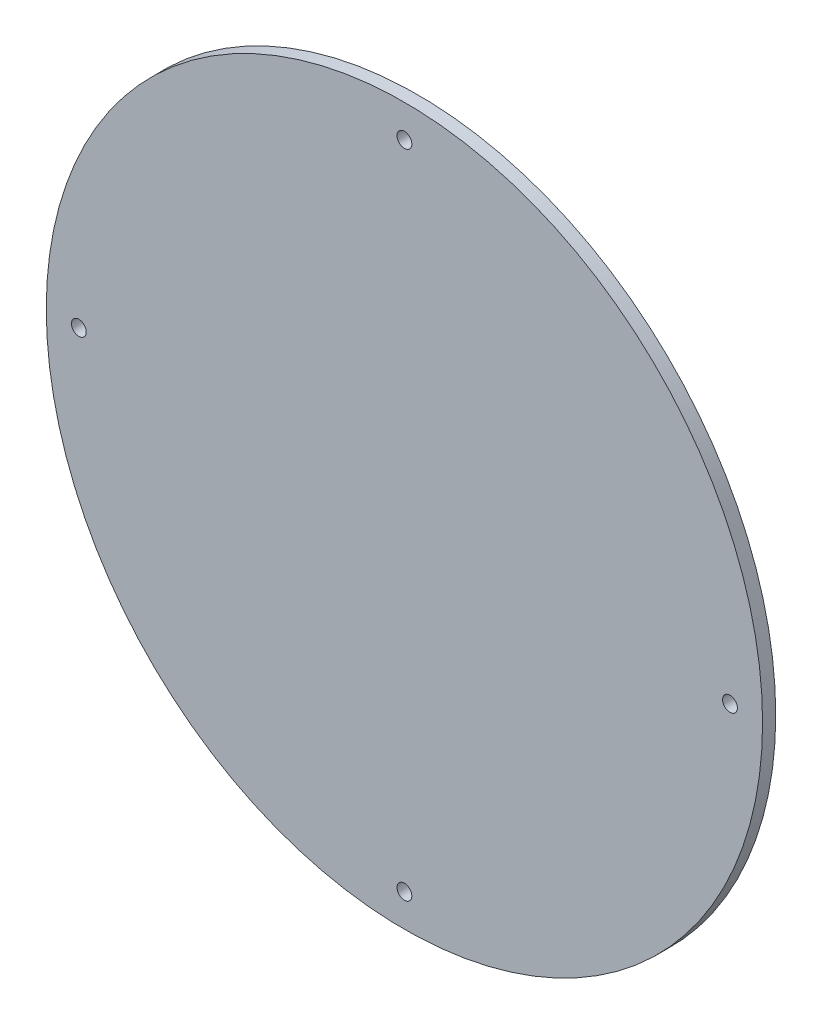
ISO-10303-21;
HEADER;
FILE_DESCRIPTION(('STEP AP214'),'2;1');
FILE_NAME('part.step','',(''),(''),'','','');
FILE_SCHEMA(('AUTOMOTIVE_DESIGN { 1 0 10303 214 1 1 1 1 }'));
ENDSEC;
DATA;
#1=APPLICATION_CONTEXT('core data for automotive mechanical design processes');
#2=APPLICATION_PROTOCOL_DEFINITION('international standard','automotive_design',2000,#1);
#3=PRODUCT_CONTEXT('',#1,'mechanical');
#4=PRODUCT('Part','Part','',(#3));
#5=PRODUCT_RELATED_PRODUCT_CATEGORY('part','',(#4));
#6=PRODUCT_DEFINITION_FORMATION('','',#4);
#7=PRODUCT_DEFINITION_CONTEXT('part definition',#1,'design');
#8=PRODUCT_DEFINITION('design','',#6,#7);
#9=PRODUCT_DEFINITION_SHAPE('','',#8);
#10=(LENGTH_UNIT() NAMED_UNIT(*) SI_UNIT(.MILLI.,.METRE.));
#11=(NAMED_UNIT(*) PLANE_ANGLE_UNIT() SI_UNIT($,.RADIAN.));
#12=(NAMED_UNIT(*) SI_UNIT($,.STERADIAN.) SOLID_ANGLE_UNIT());
#13=UNCERTAINTY_MEASURE_WITH_UNIT(LENGTH_MEASURE(1.E-05),#10,'distance_accuracy_value','');
#14=(GEOMETRIC_REPRESENTATION_CONTEXT(3) GLOBAL_UNCERTAINTY_ASSIGNED_CONTEXT((#13)) GLOBAL_UNIT_ASSIGNED_CONTEXT((#10,
#11,#12)) REPRESENTATION_CONTEXT('',''));
#15=CARTESIAN_POINT('',(0.,0.,0.));
#16=DIRECTION('',(0.,0.,1.));
#17=DIRECTION('',(1.,0.,0.));
#18=AXIS2_PLACEMENT_3D('',#15,#16,#17);
#19=CARTESIAN_POINT('',(0.,78.5,3.175));
#20=DIRECTION('',(0.,0.,-1.));
#21=DIRECTION('',(-1.,0.,0.));
#22=AXIS2_PLACEMENT_3D('',#19,#20,#21);
#23=CYLINDRICAL_SURFACE('',#22,1.7859375);
#24=CARTESIAN_POINT('',(0.,78.5,3.175));
#25=DIRECTION('',(0.,0.,1.));
#26=DIRECTION('',(1.,0.,0.));
#27=AXIS2_PLACEMENT_3D('',#24,#25,#26);
#28=CIRCLE('',#27,1.7859375);
#29=CARTESIAN_POINT('',(1.7859375,78.5,3.175));
#30=VERTEX_POINT('',#29);
#31=EDGE_CURVE('E47',#30,#30,#28,.T.);
#32=ORIENTED_EDGE('',*,*,#31,.T.);
#33=EDGE_LOOP('',(#32));
#34=FACE_BOUND('',#33,.T.);
#35=CARTESIAN_POINT('',(0.,78.5,0.));
#36=DIRECTION('',(0.,0.,1.));
#37=DIRECTION('',(1.,0.,0.));
#38=AXIS2_PLACEMENT_3D('',#35,#36,#37);
#39=CIRCLE('',#38,1.7859375);
#40=CARTESIAN_POINT('',(1.7859375,78.5,0.));
#41=VERTEX_POINT('',#40);
#42=EDGE_CURVE('E64',#41,#41,#39,.T.);
#43=ORIENTED_EDGE('',*,*,#42,.F.);
#44=EDGE_LOOP('',(#43));
#45=FACE_BOUND('',#44,.T.);
#46=ADVANCED_FACE('F39',(#34,#45),#23,.F.);
#47=CARTESIAN_POINT('',(78.5,0.,3.175));
#48=DIRECTION('',(0.,0.,-1.));
#49=DIRECTION('',(-1.,0.,0.));
#50=AXIS2_PLACEMENT_3D('',#47,#48,#49);
#51=CYLINDRICAL_SURFACE('',#50,1.7859375);
#52=CARTESIAN_POINT('',(78.5,0.,3.175));
#53=DIRECTION('',(0.,0.,1.));
#54=DIRECTION('',(1.,0.,0.));
#55=AXIS2_PLACEMENT_3D('',#52,#53,#54);
#56=CIRCLE('',#55,1.7859375);
#57=CARTESIAN_POINT('',(80.2859375,0.,3.175));
#58=VERTEX_POINT('',#57);
#59=EDGE_CURVE('E52',#58,#58,#56,.T.);
#60=ORIENTED_EDGE('',*,*,#59,.T.);
#61=EDGE_LOOP('',(#60));
#62=FACE_BOUND('',#61,.T.);
#63=CARTESIAN_POINT('',(78.5,0.,0.));
#64=DIRECTION('',(0.,0.,1.));
#65=DIRECTION('',(1.,0.,0.));
#66=AXIS2_PLACEMENT_3D('',#63,#64,#65);
#67=CIRCLE('',#66,1.7859375);
#68=CARTESIAN_POINT('',(80.2859375,0.,0.));
#69=VERTEX_POINT('',#68);
#70=EDGE_CURVE('E62',#69,#69,#67,.T.);
#71=ORIENTED_EDGE('',*,*,#70,.F.);
#72=EDGE_LOOP('',(#71));
#73=FACE_BOUND('',#72,.T.);
#74=ADVANCED_FACE('F82',(#62,#73),#51,.F.);
#75=CARTESIAN_POINT('',(0.,-78.5,3.175));
#76=DIRECTION('',(0.,0.,-1.));
#77=DIRECTION('',(-1.,0.,0.));
#78=AXIS2_PLACEMENT_3D('',#75,#76,#77);
#79=CYLINDRICAL_SURFACE('',#78,1.7859375);
#80=CARTESIAN_POINT('',(0.,-78.5,3.175));
#81=DIRECTION('',(0.,0.,1.));
#82=DIRECTION('',(1.,0.,0.));
#83=AXIS2_PLACEMENT_3D('',#80,#81,#82);
#84=CIRCLE('',#83,1.7859375);
#85=CARTESIAN_POINT('',(1.78593750000003,-78.5,3.175));
#86=VERTEX_POINT('',#85);
#87=EDGE_CURVE('E73',#86,#86,#84,.T.);
#88=ORIENTED_EDGE('',*,*,#87,.T.);
#89=EDGE_LOOP('',(#88));
#90=FACE_BOUND('',#89,.T.);
#91=CARTESIAN_POINT('',(0.,-78.5,0.));
#92=DIRECTION('',(0.,0.,1.));
#93=DIRECTION('',(1.,0.,0.));
#94=AXIS2_PLACEMENT_3D('',#91,#92,#93);
#95=CIRCLE('',#94,1.7859375);
#96=CARTESIAN_POINT('',(1.78593750000003,-78.5,0.));
#97=VERTEX_POINT('',#96);
#98=EDGE_CURVE('E59',#97,#97,#95,.T.);
#99=ORIENTED_EDGE('',*,*,#98,.F.);
#100=EDGE_LOOP('',(#99));
#101=FACE_BOUND('',#100,.T.);
#102=ADVANCED_FACE('F100',(#90,#101),#79,.F.);
#103=CARTESIAN_POINT('',(-78.5,0.,3.175));
#104=DIRECTION('',(0.,0.,-1.));
#105=DIRECTION('',(-1.,0.,0.));
#106=AXIS2_PLACEMENT_3D('',#103,#104,#105);
#107=CYLINDRICAL_SURFACE('',#106,1.7859375);
#108=CARTESIAN_POINT('',(-78.5,0.,3.175));
#109=DIRECTION('',(0.,0.,1.));
#110=DIRECTION('',(1.,0.,0.));
#111=AXIS2_PLACEMENT_3D('',#108,#109,#110);
#112=CIRCLE('',#111,1.7859375);
#113=CARTESIAN_POINT('',(-76.7140625,0.,3.175));
#114=VERTEX_POINT('',#113);
#115=EDGE_CURVE('E69',#114,#114,#112,.T.);
#116=ORIENTED_EDGE('',*,*,#115,.T.);
#117=EDGE_LOOP('',(#116));
#118=FACE_BOUND('',#117,.T.);
#119=CARTESIAN_POINT('',(-78.5,0.,0.));
#120=DIRECTION('',(0.,0.,1.));
#121=DIRECTION('',(1.,0.,0.));
#122=AXIS2_PLACEMENT_3D('',#119,#120,#121);
#123=CIRCLE('',#122,1.7859375);
#124=CARTESIAN_POINT('',(-76.7140625,0.,0.));
#125=VERTEX_POINT('',#124);
#126=EDGE_CURVE('E56',#125,#125,#123,.T.);
#127=ORIENTED_EDGE('',*,*,#126,.F.);
#128=EDGE_LOOP('',(#127));
#129=FACE_BOUND('',#128,.T.);
#130=ADVANCED_FACE('F41',(#118,#129),#107,.F.);
#131=CARTESIAN_POINT('',(0.,0.,3.175));
#132=DIRECTION('',(0.,0.,-1.));
#133=DIRECTION('',(-1.,0.,0.));
#134=AXIS2_PLACEMENT_3D('',#131,#132,#133);
#135=CYLINDRICAL_SURFACE('',#134,86.36);
#136=CARTESIAN_POINT('',(0.,0.,3.175));
#137=DIRECTION('',(0.,0.,1.));
#138=DIRECTION('',(1.,0.,0.));
#139=AXIS2_PLACEMENT_3D('',#136,#137,#138);
#140=CIRCLE('',#139,86.36);
#141=CARTESIAN_POINT('',(86.36,0.,3.175));
#142=VERTEX_POINT('',#141);
#143=EDGE_CURVE('E10',#142,#142,#140,.T.);
#144=ORIENTED_EDGE('',*,*,#143,.F.);
#145=EDGE_LOOP('',(#144));
#146=FACE_BOUND('',#145,.T.);
#147=CARTESIAN_POINT('',(0.,0.,0.));
#148=DIRECTION('',(0.,0.,1.));
#149=DIRECTION('',(1.,0.,0.));
#150=AXIS2_PLACEMENT_3D('',#147,#148,#149);
#151=CIRCLE('',#150,86.36);
#152=CARTESIAN_POINT('',(86.36,0.,0.));
#153=VERTEX_POINT('',#152);
#154=EDGE_CURVE('E43',#153,#153,#151,.T.);
#155=ORIENTED_EDGE('',*,*,#154,.T.);
#156=EDGE_LOOP('',(#155));
#157=FACE_BOUND('',#156,.T.);
#158=ADVANCED_FACE('F89',(#146,#157),#135,.T.);
#159=CARTESIAN_POINT('',(0.,0.,3.175));
#160=DIRECTION('',(0.,0.,1.));
#161=DIRECTION('',(1.,0.,0.));
#162=AXIS2_PLACEMENT_3D('',#159,#160,#161);
#163=PLANE('',#162);
#164=ORIENTED_EDGE('',*,*,#115,.F.);
#165=EDGE_LOOP('',(#164));
#166=FACE_BOUND('',#165,.T.);
#167=ORIENTED_EDGE('',*,*,#87,.F.);
#168=EDGE_LOOP('',(#167));
#169=FACE_BOUND('',#168,.T.);
#170=ORIENTED_EDGE('',*,*,#59,.F.);
#171=EDGE_LOOP('',(#170));
#172=FACE_BOUND('',#171,.T.);
#173=ORIENTED_EDGE('',*,*,#31,.F.);
#174=EDGE_LOOP('',(#173));
#175=FACE_BOUND('',#174,.T.);
#176=ORIENTED_EDGE('',*,*,#143,.T.);
#177=EDGE_LOOP('',(#176));
#178=FACE_BOUND('',#177,.T.);
#179=ADVANCED_FACE('F85',(#166,#169,#172,#175,#178),#163,.T.);
#180=CARTESIAN_POINT('',(0.,0.,0.));
#181=DIRECTION('',(0.,0.,1.));
#182=DIRECTION('',(1.,0.,0.));
#183=AXIS2_PLACEMENT_3D('',#180,#181,#182);
#184=PLANE('',#183);
#185=ORIENTED_EDGE('',*,*,#126,.T.);
#186=EDGE_LOOP('',(#185));
#187=FACE_BOUND('',#186,.T.);
#188=ORIENTED_EDGE('',*,*,#98,.T.);
#189=EDGE_LOOP('',(#188));
#190=FACE_BOUND('',#189,.T.);
#191=ORIENTED_EDGE('',*,*,#70,.T.);
#192=EDGE_LOOP('',(#191));
#193=FACE_BOUND('',#192,.T.);
#194=ORIENTED_EDGE('',*,*,#42,.T.);
#195=EDGE_LOOP('',(#194));
#196=FACE_BOUND('',#195,.T.);
#197=ORIENTED_EDGE('',*,*,#154,.F.);
#198=EDGE_LOOP('',(#197));
#199=FACE_BOUND('',#198,.T.);
#200=ADVANCED_FACE('F88',(#187,#190,#193,#196,#199),#184,.F.);
#201=CLOSED_SHELL('',(#46,#74,#102,#130,#158,#179,#200));
#202=MANIFOLD_SOLID_BREP('B2',#201);
#203=ADVANCED_BREP_SHAPE_REPRESENTATION('',(#18,#202),#14);
#204=SHAPE_DEFINITION_REPRESENTATION(#9,#203);
ENDSEC;
END-ISO-10303-21;
